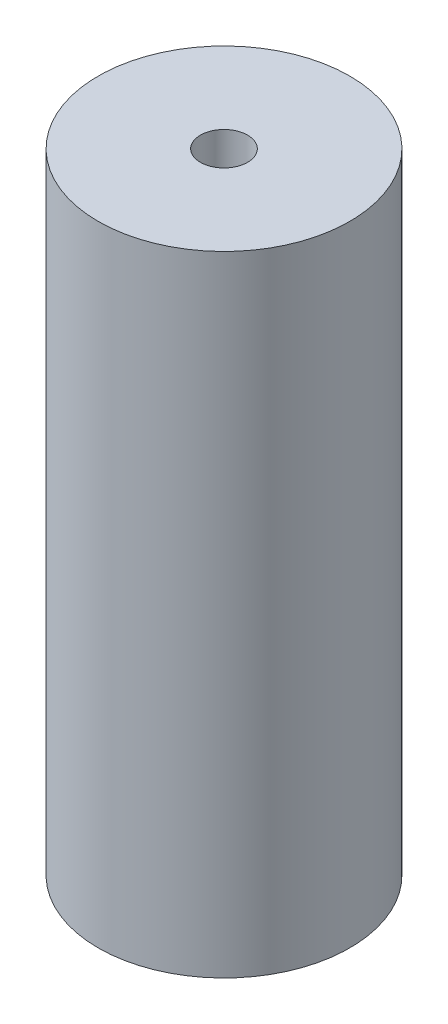
ISO-10303-21;
HEADER;
FILE_DESCRIPTION(('STEP AP214'),'2;1');
FILE_NAME('part.step','',(''),(''),'','','');
FILE_SCHEMA(('AUTOMOTIVE_DESIGN { 1 0 10303 214 1 1 1 1 }'));
ENDSEC;
DATA;
#1=APPLICATION_CONTEXT('core data for automotive mechanical design processes');
#2=APPLICATION_PROTOCOL_DEFINITION('international standard','automotive_design',2000,#1);
#3=PRODUCT_CONTEXT('',#1,'mechanical');
#4=PRODUCT('Part','Part','',(#3));
#5=PRODUCT_RELATED_PRODUCT_CATEGORY('part','',(#4));
#6=PRODUCT_DEFINITION_FORMATION('','',#4);
#7=PRODUCT_DEFINITION_CONTEXT('part definition',#1,'design');
#8=PRODUCT_DEFINITION('design','',#6,#7);
#9=PRODUCT_DEFINITION_SHAPE('','',#8);
#10=(LENGTH_UNIT() NAMED_UNIT(*) SI_UNIT(.MILLI.,.METRE.));
#11=(NAMED_UNIT(*) PLANE_ANGLE_UNIT() SI_UNIT($,.RADIAN.));
#12=(NAMED_UNIT(*) SI_UNIT($,.STERADIAN.) SOLID_ANGLE_UNIT());
#13=UNCERTAINTY_MEASURE_WITH_UNIT(LENGTH_MEASURE(1.E-05),#10,'distance_accuracy_value','');
#14=(GEOMETRIC_REPRESENTATION_CONTEXT(3) GLOBAL_UNCERTAINTY_ASSIGNED_CONTEXT((#13)) GLOBAL_UNIT_ASSIGNED_CONTEXT((#10,
#11,#12)) REPRESENTATION_CONTEXT('',''));
#15=CARTESIAN_POINT('',(0.,0.,0.));
#16=DIRECTION('',(0.,0.,1.));
#17=DIRECTION('',(1.,0.,0.));
#18=AXIS2_PLACEMENT_3D('',#15,#16,#17);
#19=CARTESIAN_POINT('',(0.,40.,0.));
#20=DIRECTION('',(0.,-1.,0.));
#21=DIRECTION('',(0.,0.,-1.));
#22=AXIS2_PLACEMENT_3D('',#19,#20,#21);
#23=CYLINDRICAL_SURFACE('',#22,8.);
#24=CARTESIAN_POINT('',(0.,40.,0.));
#25=DIRECTION('',(0.,1.,0.));
#26=DIRECTION('',(0.,0.,1.));
#27=AXIS2_PLACEMENT_3D('',#24,#25,#26);
#28=CIRCLE('',#27,8.);
#29=CARTESIAN_POINT('',(0.,40.,8.));
#30=VERTEX_POINT('',#29);
#31=EDGE_CURVE('E10',#30,#30,#28,.T.);
#32=ORIENTED_EDGE('',*,*,#31,.F.);
#33=EDGE_LOOP('',(#32));
#34=FACE_BOUND('',#33,.T.);
#35=CARTESIAN_POINT('',(0.,0.,0.));
#36=DIRECTION('',(0.,1.,0.));
#37=DIRECTION('',(0.,0.,1.));
#38=AXIS2_PLACEMENT_3D('',#35,#36,#37);
#39=CIRCLE('',#38,8.);
#40=CARTESIAN_POINT('',(0.,0.,8.));
#41=VERTEX_POINT('',#40);
#42=EDGE_CURVE('E39',#41,#41,#39,.T.);
#43=ORIENTED_EDGE('',*,*,#42,.T.);
#44=EDGE_LOOP('',(#43));
#45=FACE_BOUND('',#44,.T.);
#46=ADVANCED_FACE('F36',(#34,#45),#23,.T.);
#47=CARTESIAN_POINT('',(0.,40.,0.));
#48=DIRECTION('',(0.,1.,0.));
#49=DIRECTION('',(0.,0.,1.));
#50=AXIS2_PLACEMENT_3D('',#47,#48,#49);
#51=PLANE('',#50);
#52=CARTESIAN_POINT('',(0.,40.,0.));
#53=DIRECTION('',(0.,1.,0.));
#54=DIRECTION('',(0.,0.,1.));
#55=AXIS2_PLACEMENT_3D('',#52,#53,#54);
#56=CIRCLE('',#55,1.5);
#57=CARTESIAN_POINT('',(0.,40.,1.5));
#58=VERTEX_POINT('',#57);
#59=EDGE_CURVE('E48',#58,#58,#56,.T.);
#60=ORIENTED_EDGE('',*,*,#59,.F.);
#61=EDGE_LOOP('',(#60));
#62=FACE_BOUND('',#61,.T.);
#63=ORIENTED_EDGE('',*,*,#31,.T.);
#64=EDGE_LOOP('',(#63));
#65=FACE_BOUND('',#64,.T.);
#66=ADVANCED_FACE('F63',(#62,#65),#51,.T.);
#67=CARTESIAN_POINT('',(0.,0.,0.));
#68=DIRECTION('',(0.,1.,0.));
#69=DIRECTION('',(0.,0.,1.));
#70=AXIS2_PLACEMENT_3D('',#67,#68,#69);
#71=PLANE('',#70);
#72=CARTESIAN_POINT('',(0.,0.,0.));
#73=DIRECTION('',(0.,1.,0.));
#74=DIRECTION('',(0.,0.,1.));
#75=AXIS2_PLACEMENT_3D('',#72,#73,#74);
#76=CIRCLE('',#75,1.5);
#77=CARTESIAN_POINT('',(0.,0.,1.5));
#78=VERTEX_POINT('',#77);
#79=EDGE_CURVE('E46',#78,#78,#76,.T.);
#80=ORIENTED_EDGE('',*,*,#79,.T.);
#81=EDGE_LOOP('',(#80));
#82=FACE_BOUND('',#81,.T.);
#83=ORIENTED_EDGE('',*,*,#42,.F.);
#84=EDGE_LOOP('',(#83));
#85=FACE_BOUND('',#84,.T.);
#86=ADVANCED_FACE('F54',(#82,#85),#71,.F.);
#87=CARTESIAN_POINT('',(0.,0.,0.));
#88=DIRECTION('',(0.,1.,0.));
#89=DIRECTION('',(0.,0.,1.));
#90=AXIS2_PLACEMENT_3D('',#87,#88,#89);
#91=CYLINDRICAL_SURFACE('',#90,1.5);
#92=ORIENTED_EDGE('',*,*,#79,.F.);
#93=EDGE_LOOP('',(#92));
#94=FACE_BOUND('',#93,.T.);
#95=ORIENTED_EDGE('',*,*,#59,.T.);
#96=EDGE_LOOP('',(#95));
#97=FACE_BOUND('',#96,.T.);
#98=ADVANCED_FACE('F57',(#94,#97),#91,.F.);
#99=CLOSED_SHELL('',(#46,#66,#86,#98));
#100=MANIFOLD_SOLID_BREP('B2',#99);
#101=ADVANCED_BREP_SHAPE_REPRESENTATION('',(#18,#100),#14);
#102=SHAPE_DEFINITION_REPRESENTATION(#9,#101);
ENDSEC;
END-ISO-10303-21;
